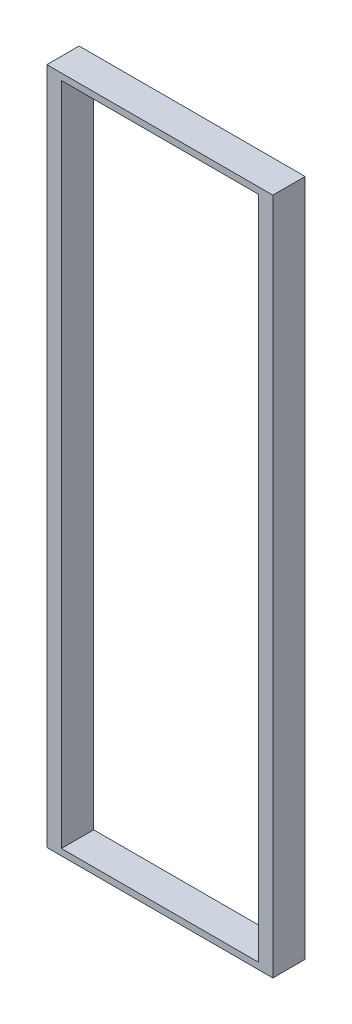
ISO-10303-21;
HEADER;
FILE_DESCRIPTION(('STEP AP214'),'2;1');
FILE_NAME('part.step','',(''),(''),'','','');
FILE_SCHEMA(('AUTOMOTIVE_DESIGN { 1 0 10303 214 1 1 1 1 }'));
ENDSEC;
DATA;
#1=APPLICATION_CONTEXT('core data for automotive mechanical design processes');
#2=APPLICATION_PROTOCOL_DEFINITION('international standard','automotive_design',2000,#1);
#3=PRODUCT_CONTEXT('',#1,'mechanical');
#4=PRODUCT('Part','Part','',(#3));
#5=PRODUCT_RELATED_PRODUCT_CATEGORY('part','',(#4));
#6=PRODUCT_DEFINITION_FORMATION('','',#4);
#7=PRODUCT_DEFINITION_CONTEXT('part definition',#1,'design');
#8=PRODUCT_DEFINITION('design','',#6,#7);
#9=PRODUCT_DEFINITION_SHAPE('','',#8);
#10=(LENGTH_UNIT() NAMED_UNIT(*) SI_UNIT(.MILLI.,.METRE.));
#11=(NAMED_UNIT(*) PLANE_ANGLE_UNIT() SI_UNIT($,.RADIAN.));
#12=(NAMED_UNIT(*) SI_UNIT($,.STERADIAN.) SOLID_ANGLE_UNIT());
#13=UNCERTAINTY_MEASURE_WITH_UNIT(LENGTH_MEASURE(1.E-05),#10,'distance_accuracy_value','');
#14=(GEOMETRIC_REPRESENTATION_CONTEXT(3) GLOBAL_UNCERTAINTY_ASSIGNED_CONTEXT((#13)) GLOBAL_UNIT_ASSIGNED_CONTEXT((#10,
#11,#12)) REPRESENTATION_CONTEXT('',''));
#15=CARTESIAN_POINT('',(0.,0.,0.));
#16=DIRECTION('',(0.,0.,1.));
#17=DIRECTION('',(1.,0.,0.));
#18=AXIS2_PLACEMENT_3D('',#15,#16,#17);
#19=CARTESIAN_POINT('',(0.,0.,100.));
#20=DIRECTION('',(0.,0.,-1.));
#21=DIRECTION('',(-1.,0.,0.));
#22=AXIS2_PLACEMENT_3D('',#19,#20,#21);
#23=PLANE('',#22);
#24=DIRECTION('',(0.,-1.,0.));
#25=VECTOR('',#24,1.);
#26=CARTESIAN_POINT('',(0.,0.,100.));
#27=LINE('',#26,#25);
#28=CARTESIAN_POINT('',(0.,2100.,100.));
#29=VERTEX_POINT('',#28);
#30=CARTESIAN_POINT('',(0.,0.,100.));
#31=VERTEX_POINT('',#30);
#32=EDGE_CURVE('E137',#29,#31,#27,.T.);
#33=ORIENTED_EDGE('',*,*,#32,.T.);
#34=DIRECTION('',(1.,0.,0.));
#35=VECTOR('',#34,1.);
#36=CARTESIAN_POINT('',(0.,0.,100.));
#37=LINE('',#36,#35);
#38=CARTESIAN_POINT('',(700.,0.,100.));
#39=VERTEX_POINT('',#38);
#40=EDGE_CURVE('E140',#31,#39,#37,.T.);
#41=ORIENTED_EDGE('',*,*,#40,.T.);
#42=DIRECTION('',(0.,1.,0.));
#43=VECTOR('',#42,1.);
#44=CARTESIAN_POINT('',(700.,0.,100.));
#45=LINE('',#44,#43);
#46=CARTESIAN_POINT('',(700.,2100.,100.));
#47=VERTEX_POINT('',#46);
#48=EDGE_CURVE('E143',#39,#47,#45,.T.);
#49=ORIENTED_EDGE('',*,*,#48,.T.);
#50=DIRECTION('',(-1.,0.,0.));
#51=VECTOR('',#50,1.);
#52=CARTESIAN_POINT('',(0.,2100.,100.));
#53=LINE('',#52,#51);
#54=EDGE_CURVE('E145',#47,#29,#53,.T.);
#55=ORIENTED_EDGE('',*,*,#54,.T.);
#56=EDGE_LOOP('',(#33,#41,#49,#55));
#57=FACE_BOUND('',#56,.T.);
#58=DIRECTION('',(0.,-1.,0.));
#59=VECTOR('',#58,1.);
#60=CARTESIAN_POINT('',(45.,2080.,100.));
#61=LINE('',#60,#59);
#62=CARTESIAN_POINT('',(45.,2080.,100.));
#63=VERTEX_POINT('',#62);
#64=CARTESIAN_POINT('',(45.0000000000006,20.,100.));
#65=VERTEX_POINT('',#64);
#66=EDGE_CURVE('E101',#63,#65,#61,.T.);
#67=ORIENTED_EDGE('',*,*,#66,.F.);
#68=DIRECTION('',(-1.,0.,0.));
#69=VECTOR('',#68,1.);
#70=CARTESIAN_POINT('',(45.,2080.,100.));
#71=LINE('',#70,#69);
#72=CARTESIAN_POINT('',(655.,2080.,100.));
#73=VERTEX_POINT('',#72);
#74=EDGE_CURVE('E123',#73,#63,#71,.T.);
#75=ORIENTED_EDGE('',*,*,#74,.F.);
#76=DIRECTION('',(0.,1.,0.));
#77=VECTOR('',#76,1.);
#78=CARTESIAN_POINT('',(655.,2080.,100.));
#79=LINE('',#78,#77);
#80=CARTESIAN_POINT('',(655.000000000001,20.,100.));
#81=VERTEX_POINT('',#80);
#82=EDGE_CURVE('E121',#81,#73,#79,.T.);
#83=ORIENTED_EDGE('',*,*,#82,.F.);
#84=DIRECTION('',(1.,0.,0.));
#85=VECTOR('',#84,1.);
#86=CARTESIAN_POINT('',(45.0000000000006,20.,100.));
#87=LINE('',#86,#85);
#88=EDGE_CURVE('E109',#65,#81,#87,.T.);
#89=ORIENTED_EDGE('',*,*,#88,.F.);
#90=EDGE_LOOP('',(#67,#75,#83,#89));
#91=FACE_BOUND('',#90,.T.);
#92=ADVANCED_FACE('F36',(#57,#91),#23,.F.);
#93=CARTESIAN_POINT('',(0.,0.,0.));
#94=DIRECTION('',(0.,0.,-1.));
#95=DIRECTION('',(-1.,0.,0.));
#96=AXIS2_PLACEMENT_3D('',#93,#94,#95);
#97=PLANE('',#96);
#98=DIRECTION('',(0.,-1.,0.));
#99=VECTOR('',#98,1.);
#100=CARTESIAN_POINT('',(0.,0.,0.));
#101=LINE('',#100,#99);
#102=CARTESIAN_POINT('',(0.,2100.,0.));
#103=VERTEX_POINT('',#102);
#104=CARTESIAN_POINT('',(0.,0.,0.));
#105=VERTEX_POINT('',#104);
#106=EDGE_CURVE('E117',#103,#105,#101,.T.);
#107=ORIENTED_EDGE('',*,*,#106,.F.);
#108=DIRECTION('',(-1.,0.,0.));
#109=VECTOR('',#108,1.);
#110=CARTESIAN_POINT('',(0.,2100.,0.));
#111=LINE('',#110,#109);
#112=CARTESIAN_POINT('',(700.,2100.,0.));
#113=VERTEX_POINT('',#112);
#114=EDGE_CURVE('E141',#113,#103,#111,.T.);
#115=ORIENTED_EDGE('',*,*,#114,.F.);
#116=DIRECTION('',(0.,1.,0.));
#117=VECTOR('',#116,1.);
#118=CARTESIAN_POINT('',(700.,0.,0.));
#119=LINE('',#118,#117);
#120=CARTESIAN_POINT('',(700.,0.,0.));
#121=VERTEX_POINT('',#120);
#122=EDGE_CURVE('E152',#121,#113,#119,.T.);
#123=ORIENTED_EDGE('',*,*,#122,.F.);
#124=DIRECTION('',(1.,0.,0.));
#125=VECTOR('',#124,1.);
#126=CARTESIAN_POINT('',(0.,0.,0.));
#127=LINE('',#126,#125);
#128=EDGE_CURVE('E150',#105,#121,#127,.T.);
#129=ORIENTED_EDGE('',*,*,#128,.F.);
#130=EDGE_LOOP('',(#107,#115,#123,#129));
#131=FACE_BOUND('',#130,.T.);
#132=DIRECTION('',(-1.,0.,0.));
#133=VECTOR('',#132,1.);
#134=CARTESIAN_POINT('',(45.,2080.,0.));
#135=LINE('',#134,#133);
#136=CARTESIAN_POINT('',(655.,2080.,0.));
#137=VERTEX_POINT('',#136);
#138=CARTESIAN_POINT('',(45.,2080.,0.));
#139=VERTEX_POINT('',#138);
#140=EDGE_CURVE('E110',#137,#139,#135,.T.);
#141=ORIENTED_EDGE('',*,*,#140,.T.);
#142=DIRECTION('',(0.,-1.,0.));
#143=VECTOR('',#142,1.);
#144=CARTESIAN_POINT('',(45.,2080.,0.));
#145=LINE('',#144,#143);
#146=CARTESIAN_POINT('',(45.0000000000006,20.,0.));
#147=VERTEX_POINT('',#146);
#148=EDGE_CURVE('E59',#139,#147,#145,.T.);
#149=ORIENTED_EDGE('',*,*,#148,.T.);
#150=DIRECTION('',(1.,0.,0.));
#151=VECTOR('',#150,1.);
#152=CARTESIAN_POINT('',(45.0000000000006,20.,0.));
#153=LINE('',#152,#151);
#154=CARTESIAN_POINT('',(655.000000000001,20.,0.));
#155=VERTEX_POINT('',#154);
#156=EDGE_CURVE('E116',#147,#155,#153,.T.);
#157=ORIENTED_EDGE('',*,*,#156,.T.);
#158=DIRECTION('',(0.,1.,0.));
#159=VECTOR('',#158,1.);
#160=CARTESIAN_POINT('',(655.,2080.,0.));
#161=LINE('',#160,#159);
#162=EDGE_CURVE('E129',#155,#137,#161,.T.);
#163=ORIENTED_EDGE('',*,*,#162,.T.);
#164=EDGE_LOOP('',(#141,#149,#157,#163));
#165=FACE_BOUND('',#164,.T.);
#166=ADVANCED_FACE('F170',(#131,#165),#97,.T.);
#167=CARTESIAN_POINT('',(0.,0.,100.));
#168=DIRECTION('',(1.,0.,0.));
#169=DIRECTION('',(0.,0.,-1.));
#170=AXIS2_PLACEMENT_3D('',#167,#168,#169);
#171=PLANE('',#170);
#172=ORIENTED_EDGE('',*,*,#106,.T.);
#173=DIRECTION('',(0.,0.,-1.));
#174=VECTOR('',#173,1.);
#175=CARTESIAN_POINT('',(0.,0.,100.));
#176=LINE('',#175,#174);
#177=EDGE_CURVE('E11',#31,#105,#176,.T.);
#178=ORIENTED_EDGE('',*,*,#177,.F.);
#179=ORIENTED_EDGE('',*,*,#32,.F.);
#180=DIRECTION('',(0.,0.,-1.));
#181=VECTOR('',#180,1.);
#182=CARTESIAN_POINT('',(0.,2100.,100.));
#183=LINE('',#182,#181);
#184=EDGE_CURVE('E147',#29,#103,#183,.T.);
#185=ORIENTED_EDGE('',*,*,#184,.T.);
#186=EDGE_LOOP('',(#172,#178,#179,#185));
#187=FACE_BOUND('',#186,.T.);
#188=ADVANCED_FACE('F38',(#187),#171,.F.);
#189=CARTESIAN_POINT('',(0.,0.,100.));
#190=DIRECTION('',(0.,1.,0.));
#191=DIRECTION('',(0.,0.,1.));
#192=AXIS2_PLACEMENT_3D('',#189,#190,#191);
#193=PLANE('',#192);
#194=ORIENTED_EDGE('',*,*,#128,.T.);
#195=DIRECTION('',(0.,0.,-1.));
#196=VECTOR('',#195,1.);
#197=CARTESIAN_POINT('',(700.,0.,100.));
#198=LINE('',#197,#196);
#199=EDGE_CURVE('E44',#39,#121,#198,.T.);
#200=ORIENTED_EDGE('',*,*,#199,.F.);
#201=ORIENTED_EDGE('',*,*,#40,.F.);
#202=ORIENTED_EDGE('',*,*,#177,.T.);
#203=EDGE_LOOP('',(#194,#200,#201,#202));
#204=FACE_BOUND('',#203,.T.);
#205=ADVANCED_FACE('F180',(#204),#193,.F.);
#206=CARTESIAN_POINT('',(700.,0.,100.));
#207=DIRECTION('',(-1.,0.,0.));
#208=DIRECTION('',(0.,0.,1.));
#209=AXIS2_PLACEMENT_3D('',#206,#207,#208);
#210=PLANE('',#209);
#211=ORIENTED_EDGE('',*,*,#122,.T.);
#212=DIRECTION('',(0.,0.,-1.));
#213=VECTOR('',#212,1.);
#214=CARTESIAN_POINT('',(700.,2100.,100.));
#215=LINE('',#214,#213);
#216=EDGE_CURVE('E157',#47,#113,#215,.T.);
#217=ORIENTED_EDGE('',*,*,#216,.F.);
#218=ORIENTED_EDGE('',*,*,#48,.F.);
#219=ORIENTED_EDGE('',*,*,#199,.T.);
#220=EDGE_LOOP('',(#211,#217,#218,#219));
#221=FACE_BOUND('',#220,.T.);
#222=ADVANCED_FACE('F164',(#221),#210,.F.);
#223=CARTESIAN_POINT('',(0.,2100.,100.));
#224=DIRECTION('',(0.,-1.,0.));
#225=DIRECTION('',(0.,0.,-1.));
#226=AXIS2_PLACEMENT_3D('',#223,#224,#225);
#227=PLANE('',#226);
#228=ORIENTED_EDGE('',*,*,#114,.T.);
#229=ORIENTED_EDGE('',*,*,#184,.F.);
#230=ORIENTED_EDGE('',*,*,#54,.F.);
#231=ORIENTED_EDGE('',*,*,#216,.T.);
#232=EDGE_LOOP('',(#228,#229,#230,#231));
#233=FACE_BOUND('',#232,.T.);
#234=ADVANCED_FACE('F174',(#233),#227,.F.);
#235=CARTESIAN_POINT('',(45.,2080.,100.));
#236=DIRECTION('',(1.,0.,0.));
#237=DIRECTION('',(0.,1.,0.));
#238=AXIS2_PLACEMENT_3D('',#235,#236,#237);
#239=PLANE('',#238);
#240=ORIENTED_EDGE('',*,*,#148,.F.);
#241=DIRECTION('',(0.,0.,-1.));
#242=VECTOR('',#241,1.);
#243=CARTESIAN_POINT('',(45.,2080.,100.));
#244=LINE('',#243,#242);
#245=EDGE_CURVE('E105',#63,#139,#244,.T.);
#246=ORIENTED_EDGE('',*,*,#245,.F.);
#247=ORIENTED_EDGE('',*,*,#66,.T.);
#248=DIRECTION('',(0.,0.,-1.));
#249=VECTOR('',#248,1.);
#250=CARTESIAN_POINT('',(45.0000000000006,20.,100.));
#251=LINE('',#250,#249);
#252=EDGE_CURVE('E104',#65,#147,#251,.T.);
#253=ORIENTED_EDGE('',*,*,#252,.T.);
#254=EDGE_LOOP('',(#240,#246,#247,#253));
#255=FACE_BOUND('',#254,.T.);
#256=ADVANCED_FACE('F103',(#255),#239,.T.);
#257=CARTESIAN_POINT('',(45.0000000000006,20.,100.));
#258=DIRECTION('',(0.,1.,0.));
#259=DIRECTION('',(0.,0.,1.));
#260=AXIS2_PLACEMENT_3D('',#257,#258,#259);
#261=PLANE('',#260);
#262=ORIENTED_EDGE('',*,*,#156,.F.);
#263=ORIENTED_EDGE('',*,*,#252,.F.);
#264=ORIENTED_EDGE('',*,*,#88,.T.);
#265=DIRECTION('',(0.,0.,-1.));
#266=VECTOR('',#265,1.);
#267=CARTESIAN_POINT('',(655.000000000001,20.,100.));
#268=LINE('',#267,#266);
#269=EDGE_CURVE('E118',#81,#155,#268,.T.);
#270=ORIENTED_EDGE('',*,*,#269,.T.);
#271=EDGE_LOOP('',(#262,#263,#264,#270));
#272=FACE_BOUND('',#271,.T.);
#273=ADVANCED_FACE('F113',(#272),#261,.T.);
#274=CARTESIAN_POINT('',(655.,2080.,100.));
#275=DIRECTION('',(-1.,0.,0.));
#276=DIRECTION('',(0.,-1.,0.));
#277=AXIS2_PLACEMENT_3D('',#274,#275,#276);
#278=PLANE('',#277);
#279=ORIENTED_EDGE('',*,*,#162,.F.);
#280=ORIENTED_EDGE('',*,*,#269,.F.);
#281=ORIENTED_EDGE('',*,*,#82,.T.);
#282=DIRECTION('',(0.,0.,-1.));
#283=VECTOR('',#282,1.);
#284=CARTESIAN_POINT('',(655.,2080.,100.));
#285=LINE('',#284,#283);
#286=EDGE_CURVE('E51',#73,#137,#285,.T.);
#287=ORIENTED_EDGE('',*,*,#286,.T.);
#288=EDGE_LOOP('',(#279,#280,#281,#287));
#289=FACE_BOUND('',#288,.T.);
#290=ADVANCED_FACE('F203',(#289),#278,.T.);
#291=CARTESIAN_POINT('',(45.,2080.,100.));
#292=DIRECTION('',(0.,-1.,0.));
#293=DIRECTION('',(0.,0.,-1.));
#294=AXIS2_PLACEMENT_3D('',#291,#292,#293);
#295=PLANE('',#294);
#296=ORIENTED_EDGE('',*,*,#140,.F.);
#297=ORIENTED_EDGE('',*,*,#286,.F.);
#298=ORIENTED_EDGE('',*,*,#74,.T.);
#299=ORIENTED_EDGE('',*,*,#245,.T.);
#300=EDGE_LOOP('',(#296,#297,#298,#299));
#301=FACE_BOUND('',#300,.T.);
#302=ADVANCED_FACE('F207',(#301),#295,.T.);
#303=CLOSED_SHELL('',(#92,#166,#188,#205,#222,#234,#256,#273,#290,#302));
#304=MANIFOLD_SOLID_BREP('B2',#303);
#305=ADVANCED_BREP_SHAPE_REPRESENTATION('',(#18,#304),#14);
#306=SHAPE_DEFINITION_REPRESENTATION(#9,#305);
ENDSEC;
END-ISO-10303-21;
